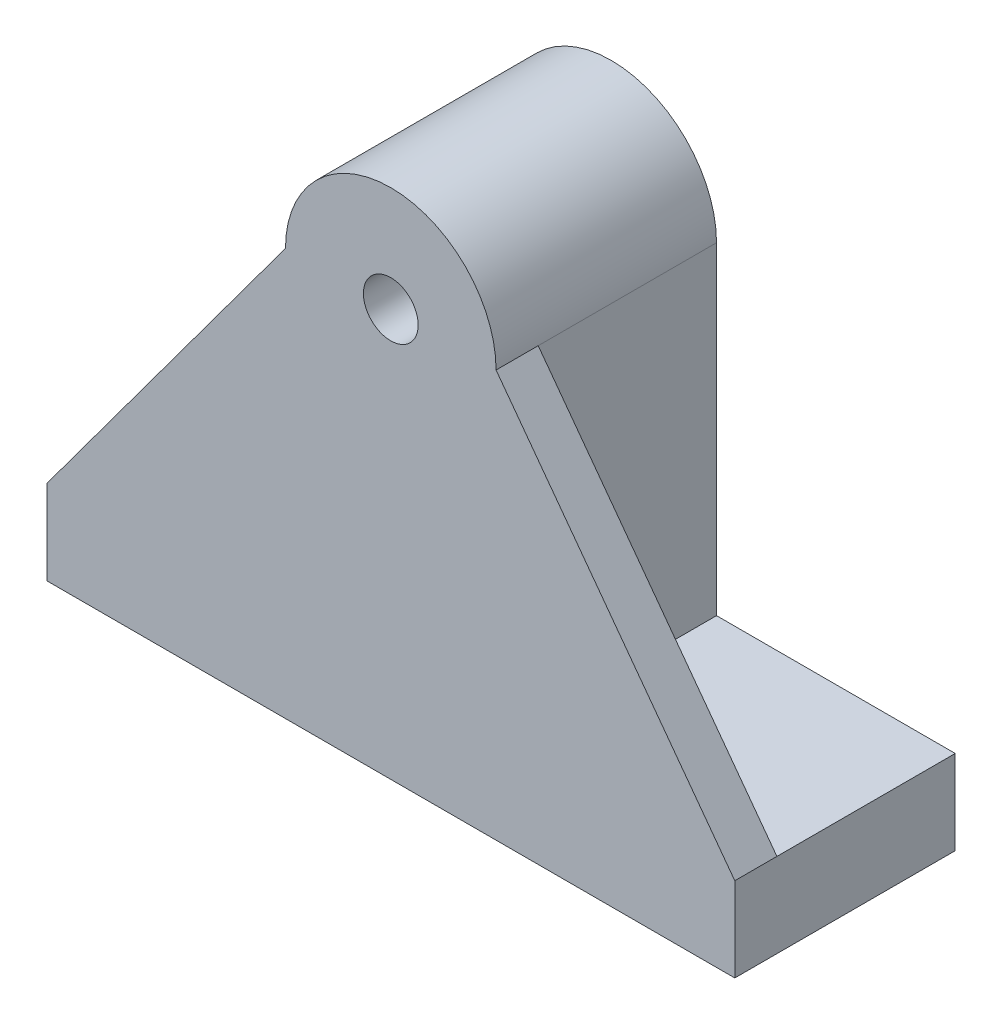
ISO-10303-21;
HEADER;
FILE_DESCRIPTION(('STEP AP214'),'2;1');
FILE_NAME('part.step','',(''),(''),'','','');
FILE_SCHEMA(('AUTOMOTIVE_DESIGN { 1 0 10303 214 1 1 1 1 }'));
ENDSEC;
DATA;
#1=APPLICATION_CONTEXT('core data for automotive mechanical design processes');
#2=APPLICATION_PROTOCOL_DEFINITION('international standard','automotive_design',2000,#1);
#3=PRODUCT_CONTEXT('',#1,'mechanical');
#4=PRODUCT('Part','Part','',(#3));
#5=PRODUCT_RELATED_PRODUCT_CATEGORY('part','',(#4));
#6=PRODUCT_DEFINITION_FORMATION('','',#4);
#7=PRODUCT_DEFINITION_CONTEXT('part definition',#1,'design');
#8=PRODUCT_DEFINITION('design','',#6,#7);
#9=PRODUCT_DEFINITION_SHAPE('','',#8);
#10=(LENGTH_UNIT() NAMED_UNIT(*) SI_UNIT(.MILLI.,.METRE.));
#11=(NAMED_UNIT(*) PLANE_ANGLE_UNIT() SI_UNIT($,.RADIAN.));
#12=(NAMED_UNIT(*) SI_UNIT($,.STERADIAN.) SOLID_ANGLE_UNIT());
#13=UNCERTAINTY_MEASURE_WITH_UNIT(LENGTH_MEASURE(1.E-05),#10,'distance_accuracy_value','');
#14=(GEOMETRIC_REPRESENTATION_CONTEXT(3) GLOBAL_UNCERTAINTY_ASSIGNED_CONTEXT((#13)) GLOBAL_UNIT_ASSIGNED_CONTEXT((#10,
#11,#12)) REPRESENTATION_CONTEXT('',''));
#15=CARTESIAN_POINT('',(0.,0.,0.));
#16=DIRECTION('',(0.,0.,1.));
#17=DIRECTION('',(1.,0.,0.));
#18=AXIS2_PLACEMENT_3D('',#15,#16,#17);
#19=CARTESIAN_POINT('',(-7.5,0.,-10.5));
#20=DIRECTION('',(-1.,0.,0.));
#21=DIRECTION('',(0.,-1.,0.));
#22=AXIS2_PLACEMENT_3D('',#19,#20,#21);
#23=PLANE('',#22);
#24=DIRECTION('',(0.,1.,0.));
#25=VECTOR('',#24,1.);
#26=CARTESIAN_POINT('',(-7.5,-23.,-5.2));
#27=LINE('',#26,#25);
#28=CARTESIAN_POINT('',(-7.5,-23.,-5.2));
#29=VERTEX_POINT('',#28);
#30=CARTESIAN_POINT('',(-7.5,0.,-5.2));
#31=VERTEX_POINT('',#30);
#32=EDGE_CURVE('E122',#29,#31,#27,.T.);
#33=ORIENTED_EDGE('',*,*,#32,.F.);
#34=DIRECTION('',(0.,0.,1.));
#35=VECTOR('',#34,1.);
#36=CARTESIAN_POINT('',(-7.5,-23.,-10.5));
#37=LINE('',#36,#35);
#38=CARTESIAN_POINT('',(-7.5,-23.,7.49999999999999));
#39=VERTEX_POINT('',#38);
#40=EDGE_CURVE('E167',#29,#39,#37,.T.);
#41=ORIENTED_EDGE('',*,*,#40,.T.);
#42=DIRECTION('',(0.,1.,0.));
#43=VECTOR('',#42,1.);
#44=CARTESIAN_POINT('',(-7.5,0.,7.5));
#45=LINE('',#44,#43);
#46=CARTESIAN_POINT('',(-7.5,0.,7.49999999999999));
#47=VERTEX_POINT('',#46);
#48=EDGE_CURVE('E131',#39,#47,#45,.T.);
#49=ORIENTED_EDGE('',*,*,#48,.T.);
#50=DIRECTION('',(0.,0.,1.));
#51=VECTOR('',#50,1.);
#52=CARTESIAN_POINT('',(-7.5,0.,-10.5));
#53=LINE('',#52,#51);
#54=EDGE_CURVE('E61',#31,#47,#53,.T.);
#55=ORIENTED_EDGE('',*,*,#54,.F.);
#56=EDGE_LOOP('',(#33,#41,#49,#55));
#57=FACE_BOUND('',#56,.T.);
#58=ADVANCED_FACE('F38',(#57),#23,.T.);
#59=CARTESIAN_POINT('',(-24.5,-23.,-10.5));
#60=DIRECTION('',(0.,-1.,0.));
#61=DIRECTION('',(0.,0.,-1.));
#62=AXIS2_PLACEMENT_3D('',#59,#60,#61);
#63=PLANE('',#62);
#64=ORIENTED_EDGE('',*,*,#40,.F.);
#65=DIRECTION('',(1.,0.,0.));
#66=VECTOR('',#65,1.);
#67=CARTESIAN_POINT('',(-24.5,-23.,-5.2));
#68=LINE('',#67,#66);
#69=CARTESIAN_POINT('',(-24.5,-23.,-5.2));
#70=VERTEX_POINT('',#69);
#71=EDGE_CURVE('E125',#70,#29,#68,.T.);
#72=ORIENTED_EDGE('',*,*,#71,.F.);
#73=DIRECTION('',(0.,0.,1.));
#74=VECTOR('',#73,1.);
#75=CARTESIAN_POINT('',(-24.5,-23.,-10.5));
#76=LINE('',#75,#74);
#77=CARTESIAN_POINT('',(-24.5,-23.,7.5));
#78=VERTEX_POINT('',#77);
#79=EDGE_CURVE('E171',#70,#78,#76,.T.);
#80=ORIENTED_EDGE('',*,*,#79,.T.);
#81=DIRECTION('',(-1.,0.,0.));
#82=VECTOR('',#81,1.);
#83=CARTESIAN_POINT('',(-24.5,-23.,7.5));
#84=LINE('',#83,#82);
#85=EDGE_CURVE('E13',#39,#78,#84,.T.);
#86=ORIENTED_EDGE('',*,*,#85,.F.);
#87=EDGE_LOOP('',(#64,#72,#80,#86));
#88=FACE_BOUND('',#87,.T.);
#89=ADVANCED_FACE('F226',(#88),#63,.F.);
#90=CARTESIAN_POINT('',(7.5,-23.,-10.5));
#91=DIRECTION('',(1.,0.,0.));
#92=DIRECTION('',(0.,0.,-1.));
#93=AXIS2_PLACEMENT_3D('',#90,#91,#92);
#94=PLANE('',#93);
#95=DIRECTION('',(0.,-1.,0.));
#96=VECTOR('',#95,1.);
#97=CARTESIAN_POINT('',(7.5,0.,-5.2));
#98=LINE('',#97,#96);
#99=CARTESIAN_POINT('',(7.5,0.,-5.2));
#100=VERTEX_POINT('',#99);
#101=CARTESIAN_POINT('',(7.5,-23.,-5.2));
#102=VERTEX_POINT('',#101);
#103=EDGE_CURVE('E118',#100,#102,#98,.T.);
#104=ORIENTED_EDGE('',*,*,#103,.F.);
#105=DIRECTION('',(0.,0.,1.));
#106=VECTOR('',#105,1.);
#107=CARTESIAN_POINT('',(7.5,0.,-10.5));
#108=LINE('',#107,#106);
#109=CARTESIAN_POINT('',(7.5,0.,7.5));
#110=VERTEX_POINT('',#109);
#111=EDGE_CURVE('E46',#100,#110,#108,.T.);
#112=ORIENTED_EDGE('',*,*,#111,.T.);
#113=DIRECTION('',(0.,-1.,0.));
#114=VECTOR('',#113,1.);
#115=CARTESIAN_POINT('',(7.5,-23.,7.5));
#116=LINE('',#115,#114);
#117=CARTESIAN_POINT('',(7.5,-23.,7.5));
#118=VERTEX_POINT('',#117);
#119=EDGE_CURVE('E149',#110,#118,#116,.T.);
#120=ORIENTED_EDGE('',*,*,#119,.T.);
#121=DIRECTION('',(0.,0.,1.));
#122=VECTOR('',#121,1.);
#123=CARTESIAN_POINT('',(7.5,-23.,-10.5));
#124=LINE('',#123,#122);
#125=EDGE_CURVE('E142',#102,#118,#124,.T.);
#126=ORIENTED_EDGE('',*,*,#125,.F.);
#127=EDGE_LOOP('',(#104,#112,#120,#126));
#128=FACE_BOUND('',#127,.T.);
#129=ADVANCED_FACE('F228',(#128),#94,.T.);
#130=CARTESIAN_POINT('',(24.5,-23.,-10.5));
#131=DIRECTION('',(0.,1.,0.));
#132=DIRECTION('',(0.,0.,1.));
#133=AXIS2_PLACEMENT_3D('',#130,#131,#132);
#134=PLANE('',#133);
#135=DIRECTION('',(1.,0.,0.));
#136=VECTOR('',#135,1.);
#137=CARTESIAN_POINT('',(7.5,-23.,-5.2));
#138=LINE('',#137,#136);
#139=CARTESIAN_POINT('',(24.5,-23.,-5.2));
#140=VERTEX_POINT('',#139);
#141=EDGE_CURVE('E183',#102,#140,#138,.T.);
#142=ORIENTED_EDGE('',*,*,#141,.F.);
#143=ORIENTED_EDGE('',*,*,#125,.T.);
#144=DIRECTION('',(1.,0.,0.));
#145=VECTOR('',#144,1.);
#146=CARTESIAN_POINT('',(24.5,-23.,7.5));
#147=LINE('',#146,#145);
#148=CARTESIAN_POINT('',(24.5,-23.,7.5));
#149=VERTEX_POINT('',#148);
#150=EDGE_CURVE('E152',#118,#149,#147,.T.);
#151=ORIENTED_EDGE('',*,*,#150,.T.);
#152=DIRECTION('',(0.,0.,1.));
#153=VECTOR('',#152,1.);
#154=CARTESIAN_POINT('',(24.5,-23.,-10.5));
#155=LINE('',#154,#153);
#156=EDGE_CURVE('E135',#140,#149,#155,.T.);
#157=ORIENTED_EDGE('',*,*,#156,.F.);
#158=EDGE_LOOP('',(#142,#143,#151,#157));
#159=FACE_BOUND('',#158,.T.);
#160=ADVANCED_FACE('F235',(#159),#134,.T.);
#161=CARTESIAN_POINT('',(0.,0.,-10.5));
#162=DIRECTION('',(0.,0.,1.));
#163=DIRECTION('',(1.,0.,0.));
#164=AXIS2_PLACEMENT_3D('',#161,#162,#163);
#165=CYLINDRICAL_SURFACE('',#164,7.5);
#166=CARTESIAN_POINT('',(0.,0.,-5.2));
#167=DIRECTION('',(0.,0.,1.));
#168=DIRECTION('',(1.,0.,0.));
#169=AXIS2_PLACEMENT_3D('',#166,#167,#168);
#170=CIRCLE('',#169,7.5);
#171=EDGE_CURVE('E114',#31,#100,#170,.F.);
#172=ORIENTED_EDGE('',*,*,#171,.F.);
#173=ORIENTED_EDGE('',*,*,#54,.T.);
#174=DIRECTION('',(0.,0.,1.));
#175=VECTOR('',#174,1.);
#176=CARTESIAN_POINT('',(-7.5,0.,-10.5));
#177=LINE('',#176,#175);
#178=CARTESIAN_POINT('',(-7.5,0.,10.5));
#179=VERTEX_POINT('',#178);
#180=EDGE_CURVE('E175',#179,#47,#177,.F.);
#181=ORIENTED_EDGE('',*,*,#180,.F.);
#182=CARTESIAN_POINT('',(0.,0.,10.5));
#183=DIRECTION('',(0.,0.,1.));
#184=DIRECTION('',(1.,0.,0.));
#185=AXIS2_PLACEMENT_3D('',#182,#183,#184);
#186=CIRCLE('',#185,7.5);
#187=CARTESIAN_POINT('',(7.5,0.,10.5));
#188=VERTEX_POINT('',#187);
#189=EDGE_CURVE('E147',#188,#179,#186,.T.);
#190=ORIENTED_EDGE('',*,*,#189,.F.);
#191=DIRECTION('',(0.,0.,-1.));
#192=VECTOR('',#191,1.);
#193=CARTESIAN_POINT('',(7.5,0.,-10.5));
#194=LINE('',#193,#192);
#195=EDGE_CURVE('E155',#110,#188,#194,.F.);
#196=ORIENTED_EDGE('',*,*,#195,.F.);
#197=ORIENTED_EDGE('',*,*,#111,.F.);
#198=EDGE_LOOP('',(#172,#173,#181,#190,#196,#197));
#199=FACE_BOUND('',#198,.T.);
#200=ADVANCED_FACE('F40',(#199),#165,.T.);
#201=CARTESIAN_POINT('',(24.5,-29.,-10.5));
#202=DIRECTION('',(1.,0.,0.));
#203=DIRECTION('',(0.,0.,-1.));
#204=AXIS2_PLACEMENT_3D('',#201,#202,#203);
#205=PLANE('',#204);
#206=DIRECTION('',(0.,-1.,0.));
#207=VECTOR('',#206,1.);
#208=CARTESIAN_POINT('',(24.5,-23.,-5.2));
#209=LINE('',#208,#207);
#210=CARTESIAN_POINT('',(24.5,-29.,-5.2));
#211=VERTEX_POINT('',#210);
#212=EDGE_CURVE('E185',#140,#211,#209,.T.);
#213=ORIENTED_EDGE('',*,*,#212,.F.);
#214=ORIENTED_EDGE('',*,*,#156,.T.);
#215=DIRECTION('',(0.,0.,-1.));
#216=VECTOR('',#215,1.);
#217=CARTESIAN_POINT('',(24.5,-23.,-10.5));
#218=LINE('',#217,#216);
#219=CARTESIAN_POINT('',(24.5,-23.,10.5));
#220=VERTEX_POINT('',#219);
#221=EDGE_CURVE('E158',#149,#220,#218,.F.);
#222=ORIENTED_EDGE('',*,*,#221,.T.);
#223=DIRECTION('',(0.,1.,0.));
#224=VECTOR('',#223,1.);
#225=CARTESIAN_POINT('',(24.5,-29.,10.5));
#226=LINE('',#225,#224);
#227=CARTESIAN_POINT('',(24.5,-29.,10.5));
#228=VERTEX_POINT('',#227);
#229=EDGE_CURVE('E134',#228,#220,#226,.T.);
#230=ORIENTED_EDGE('',*,*,#229,.F.);
#231=DIRECTION('',(0.,0.,1.));
#232=VECTOR('',#231,1.);
#233=CARTESIAN_POINT('',(24.5,-29.,-10.5));
#234=LINE('',#233,#232);
#235=EDGE_CURVE('E133',#211,#228,#234,.T.);
#236=ORIENTED_EDGE('',*,*,#235,.F.);
#237=EDGE_LOOP('',(#213,#214,#222,#230,#236));
#238=FACE_BOUND('',#237,.T.);
#239=ADVANCED_FACE('F251',(#238),#205,.T.);
#240=CARTESIAN_POINT('',(-7.5,-29.,-10.5));
#241=DIRECTION('',(0.,-1.,0.));
#242=DIRECTION('',(0.,0.,-1.));
#243=AXIS2_PLACEMENT_3D('',#240,#241,#242);
#244=PLANE('',#243);
#245=DIRECTION('',(-1.,0.,0.));
#246=VECTOR('',#245,1.);
#247=CARTESIAN_POINT('',(24.5,-29.,-5.2));
#248=LINE('',#247,#246);
#249=CARTESIAN_POINT('',(-24.5,-29.,-5.2));
#250=VERTEX_POINT('',#249);
#251=EDGE_CURVE('E53',#211,#250,#248,.T.);
#252=ORIENTED_EDGE('',*,*,#251,.F.);
#253=ORIENTED_EDGE('',*,*,#235,.T.);
#254=DIRECTION('',(1.,0.,0.));
#255=VECTOR('',#254,1.);
#256=CARTESIAN_POINT('',(-7.5,-29.,10.5));
#257=LINE('',#256,#255);
#258=CARTESIAN_POINT('',(-24.5,-29.,10.5));
#259=VERTEX_POINT('',#258);
#260=EDGE_CURVE('E138',#259,#228,#257,.T.);
#261=ORIENTED_EDGE('',*,*,#260,.F.);
#262=DIRECTION('',(0.,0.,1.));
#263=VECTOR('',#262,1.);
#264=CARTESIAN_POINT('',(-24.5,-29.,-10.5));
#265=LINE('',#264,#263);
#266=EDGE_CURVE('E165',#250,#259,#265,.T.);
#267=ORIENTED_EDGE('',*,*,#266,.F.);
#268=EDGE_LOOP('',(#252,#253,#261,#267));
#269=FACE_BOUND('',#268,.T.);
#270=ADVANCED_FACE('F209',(#269),#244,.T.);
#271=CARTESIAN_POINT('',(0.,0.,10.5));
#272=DIRECTION('',(0.,0.,1.));
#273=DIRECTION('',(1.,0.,0.));
#274=AXIS2_PLACEMENT_3D('',#271,#272,#273);
#275=PLANE('',#274);
#276=CARTESIAN_POINT('',(0.,0.,10.5));
#277=DIRECTION('',(0.,0.,1.));
#278=DIRECTION('',(1.,0.,0.));
#279=AXIS2_PLACEMENT_3D('',#276,#277,#278);
#280=CIRCLE('',#279,1.95);
#281=CARTESIAN_POINT('',(1.95,0.,10.5));
#282=VERTEX_POINT('',#281);
#283=EDGE_CURVE('E192',#282,#282,#280,.T.);
#284=ORIENTED_EDGE('',*,*,#283,.F.);
#285=EDGE_LOOP('',(#284));
#286=FACE_BOUND('',#285,.T.);
#287=ORIENTED_EDGE('',*,*,#189,.T.);
#288=DIRECTION('',(-0.594391061083806,-0.804176141466325,0.));
#289=VECTOR('',#288,1.);
#290=CARTESIAN_POINT('',(-7.5,0.,10.5));
#291=LINE('',#290,#289);
#292=CARTESIAN_POINT('',(-24.5,-23.,10.5));
#293=VERTEX_POINT('',#292);
#294=EDGE_CURVE('E178',#179,#293,#291,.T.);
#295=ORIENTED_EDGE('',*,*,#294,.T.);
#296=DIRECTION('',(0.,1.,0.));
#297=VECTOR('',#296,1.);
#298=CARTESIAN_POINT('',(-24.5,-29.,10.5));
#299=LINE('',#298,#297);
#300=EDGE_CURVE('E170',#259,#293,#299,.T.);
#301=ORIENTED_EDGE('',*,*,#300,.F.);
#302=ORIENTED_EDGE('',*,*,#260,.T.);
#303=ORIENTED_EDGE('',*,*,#229,.T.);
#304=DIRECTION('',(0.594391061083806,-0.804176141466325,0.));
#305=VECTOR('',#304,1.);
#306=CARTESIAN_POINT('',(7.5,0.,10.5));
#307=LINE('',#306,#305);
#308=EDGE_CURVE('E161',#188,#220,#307,.T.);
#309=ORIENTED_EDGE('',*,*,#308,.F.);
#310=EDGE_LOOP('',(#287,#295,#301,#302,#303,#309));
#311=FACE_BOUND('',#310,.T.);
#312=ADVANCED_FACE('F205',(#286,#311),#275,.T.);
#313=CARTESIAN_POINT('',(7.5,0.,10.5));
#314=DIRECTION('',(-0.804176141466325,-0.594391061083806,0.));
#315=DIRECTION('',(0.594391061083806,-0.804176141466325,0.));
#316=AXIS2_PLACEMENT_3D('',#313,#314,#315);
#317=PLANE('',#316);
#318=DIRECTION('',(0.594391061083806,-0.804176141466325,0.));
#319=VECTOR('',#318,1.);
#320=CARTESIAN_POINT('',(7.5,0.,7.5));
#321=LINE('',#320,#319);
#322=EDGE_CURVE('E162',#110,#149,#321,.T.);
#323=ORIENTED_EDGE('',*,*,#322,.F.);
#324=ORIENTED_EDGE('',*,*,#195,.T.);
#325=ORIENTED_EDGE('',*,*,#308,.T.);
#326=ORIENTED_EDGE('',*,*,#221,.F.);
#327=EDGE_LOOP('',(#323,#324,#325,#326));
#328=FACE_BOUND('',#327,.T.);
#329=ADVANCED_FACE('F208',(#328),#317,.F.);
#330=CARTESIAN_POINT('',(8.5,-10.75,7.5));
#331=DIRECTION('',(0.,0.,1.));
#332=DIRECTION('',(1.,0.,0.));
#333=AXIS2_PLACEMENT_3D('',#330,#331,#332);
#334=PLANE('',#333);
#335=ORIENTED_EDGE('',*,*,#119,.F.);
#336=ORIENTED_EDGE('',*,*,#322,.T.);
#337=ORIENTED_EDGE('',*,*,#150,.F.);
#338=EDGE_LOOP('',(#335,#336,#337));
#339=FACE_BOUND('',#338,.T.);
#340=ADVANCED_FACE('F242',(#339),#334,.F.);
#341=CARTESIAN_POINT('',(-24.5,-29.,-10.5));
#342=DIRECTION('',(1.,0.,0.));
#343=DIRECTION('',(0.,0.,-1.));
#344=AXIS2_PLACEMENT_3D('',#341,#342,#343);
#345=PLANE('',#344);
#346=ORIENTED_EDGE('',*,*,#79,.F.);
#347=DIRECTION('',(0.,1.,0.));
#348=VECTOR('',#347,1.);
#349=CARTESIAN_POINT('',(-24.5,-29.,-5.2));
#350=LINE('',#349,#348);
#351=EDGE_CURVE('E188',#250,#70,#350,.T.);
#352=ORIENTED_EDGE('',*,*,#351,.F.);
#353=ORIENTED_EDGE('',*,*,#266,.T.);
#354=ORIENTED_EDGE('',*,*,#300,.T.);
#355=EDGE_CURVE('E169',#78,#293,#76,.T.);
#356=ORIENTED_EDGE('',*,*,#355,.F.);
#357=EDGE_LOOP('',(#346,#352,#353,#354,#356));
#358=FACE_BOUND('',#357,.T.);
#359=ADVANCED_FACE('F221',(#358),#345,.F.);
#360=CARTESIAN_POINT('',(-7.5,0.,10.5));
#361=DIRECTION('',(-0.804176141466325,0.594391061083806,0.));
#362=DIRECTION('',(-0.594391061083806,-0.804176141466325,0.));
#363=AXIS2_PLACEMENT_3D('',#360,#361,#362);
#364=PLANE('',#363);
#365=ORIENTED_EDGE('',*,*,#294,.F.);
#366=ORIENTED_EDGE('',*,*,#180,.T.);
#367=DIRECTION('',(-0.594391061083806,-0.804176141466325,0.));
#368=VECTOR('',#367,1.);
#369=CARTESIAN_POINT('',(-7.5,0.,7.5));
#370=LINE('',#369,#368);
#371=EDGE_CURVE('E128',#47,#78,#370,.T.);
#372=ORIENTED_EDGE('',*,*,#371,.T.);
#373=ORIENTED_EDGE('',*,*,#355,.T.);
#374=EDGE_LOOP('',(#365,#366,#372,#373));
#375=FACE_BOUND('',#374,.T.);
#376=ADVANCED_FACE('F217',(#375),#364,.T.);
#377=CARTESIAN_POINT('',(0.,-10.75,7.5));
#378=DIRECTION('',(0.,0.,1.));
#379=DIRECTION('',(1.,0.,0.));
#380=AXIS2_PLACEMENT_3D('',#377,#378,#379);
#381=PLANE('',#380);
#382=ORIENTED_EDGE('',*,*,#48,.F.);
#383=ORIENTED_EDGE('',*,*,#85,.T.);
#384=ORIENTED_EDGE('',*,*,#371,.F.);
#385=EDGE_LOOP('',(#382,#383,#384));
#386=FACE_BOUND('',#385,.T.);
#387=ADVANCED_FACE('F224',(#386),#381,.F.);
#388=CARTESIAN_POINT('',(8.5,-10.75,-5.2));
#389=DIRECTION('',(0.,0.,1.));
#390=DIRECTION('',(1.,0.,0.));
#391=AXIS2_PLACEMENT_3D('',#388,#389,#390);
#392=PLANE('',#391);
#393=CARTESIAN_POINT('',(0.,0.,-5.2));
#394=DIRECTION('',(0.,0.,1.));
#395=DIRECTION('',(1.,0.,0.));
#396=AXIS2_PLACEMENT_3D('',#393,#394,#395);
#397=CIRCLE('',#396,1.95);
#398=CARTESIAN_POINT('',(1.95,0.,-5.2));
#399=VERTEX_POINT('',#398);
#400=EDGE_CURVE('E119',#399,#399,#397,.T.);
#401=ORIENTED_EDGE('',*,*,#400,.T.);
#402=EDGE_LOOP('',(#401));
#403=FACE_BOUND('',#402,.T.);
#404=ORIENTED_EDGE('',*,*,#32,.T.);
#405=ORIENTED_EDGE('',*,*,#171,.T.);
#406=ORIENTED_EDGE('',*,*,#103,.T.);
#407=ORIENTED_EDGE('',*,*,#141,.T.);
#408=ORIENTED_EDGE('',*,*,#212,.T.);
#409=ORIENTED_EDGE('',*,*,#251,.T.);
#410=ORIENTED_EDGE('',*,*,#351,.T.);
#411=ORIENTED_EDGE('',*,*,#71,.T.);
#412=EDGE_LOOP('',(#404,#405,#406,#407,#408,#409,#410,#411));
#413=FACE_BOUND('',#412,.T.);
#414=ADVANCED_FACE('F123',(#403,#413),#392,.F.);
#415=CARTESIAN_POINT('',(0.,0.,-5.2));
#416=DIRECTION('',(0.,0.,1.));
#417=DIRECTION('',(1.,0.,0.));
#418=AXIS2_PLACEMENT_3D('',#415,#416,#417);
#419=CYLINDRICAL_SURFACE('',#418,1.95);
#420=ORIENTED_EDGE('',*,*,#400,.F.);
#421=EDGE_LOOP('',(#420));
#422=FACE_BOUND('',#421,.T.);
#423=ORIENTED_EDGE('',*,*,#283,.T.);
#424=EDGE_LOOP('',(#423));
#425=FACE_BOUND('',#424,.T.);
#426=ADVANCED_FACE('F199',(#422,#425),#419,.F.);
#427=CLOSED_SHELL('',(#58,#89,#129,#160,#200,#239,#270,#312,#329,#340,#359,#376,#387,#414,#426));
#428=MANIFOLD_SOLID_BREP('B2',#427);
#429=ADVANCED_BREP_SHAPE_REPRESENTATION('',(#18,#428),#14);
#430=SHAPE_DEFINITION_REPRESENTATION(#9,#429);
ENDSEC;
END-ISO-10303-21;
